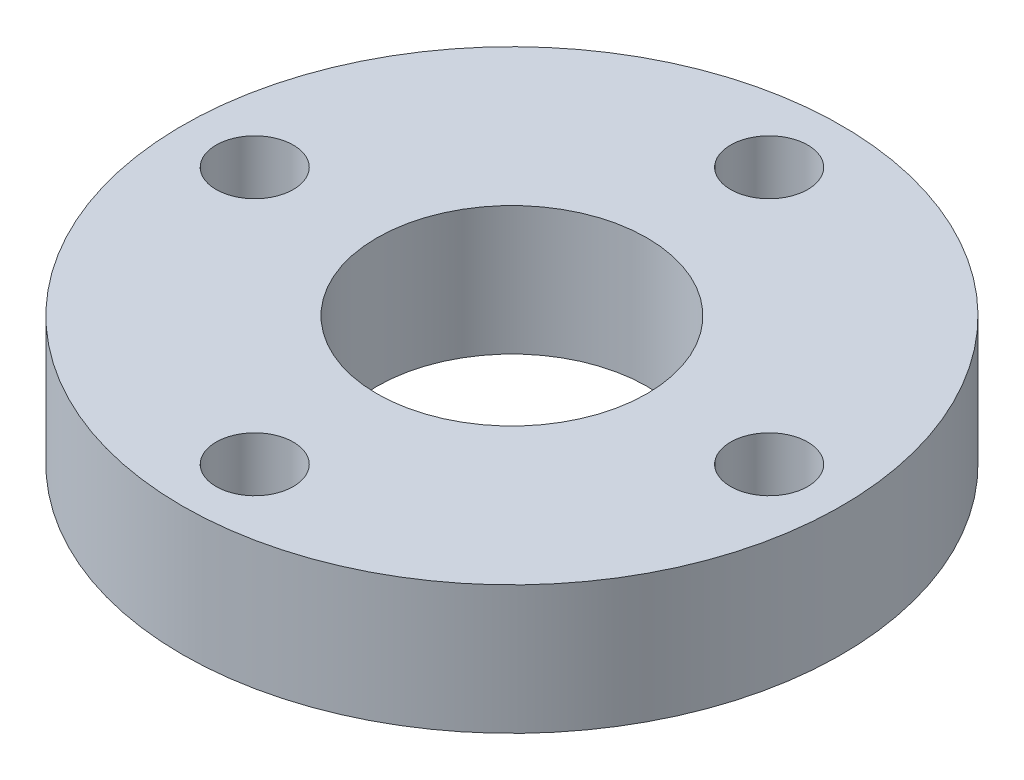
ISO-10303-21;
HEADER;
FILE_DESCRIPTION(('STEP AP214'),'2;1');
FILE_NAME('part.step','',(''),(''),'','','');
FILE_SCHEMA(('AUTOMOTIVE_DESIGN { 1 0 10303 214 1 1 1 1 }'));
ENDSEC;
DATA;
#1=APPLICATION_CONTEXT('core data for automotive mechanical design processes');
#2=APPLICATION_PROTOCOL_DEFINITION('international standard','automotive_design',2000,#1);
#3=PRODUCT_CONTEXT('',#1,'mechanical');
#4=PRODUCT('Part','Part','',(#3));
#5=PRODUCT_RELATED_PRODUCT_CATEGORY('part','',(#4));
#6=PRODUCT_DEFINITION_FORMATION('','',#4);
#7=PRODUCT_DEFINITION_CONTEXT('part definition',#1,'design');
#8=PRODUCT_DEFINITION('design','',#6,#7);
#9=PRODUCT_DEFINITION_SHAPE('','',#8);
#10=(LENGTH_UNIT() NAMED_UNIT(*) SI_UNIT(.MILLI.,.METRE.));
#11=(NAMED_UNIT(*) PLANE_ANGLE_UNIT() SI_UNIT($,.RADIAN.));
#12=(NAMED_UNIT(*) SI_UNIT($,.STERADIAN.) SOLID_ANGLE_UNIT());
#13=UNCERTAINTY_MEASURE_WITH_UNIT(LENGTH_MEASURE(1.E-05),#10,'distance_accuracy_value','');
#14=(GEOMETRIC_REPRESENTATION_CONTEXT(3) GLOBAL_UNCERTAINTY_ASSIGNED_CONTEXT((#13)) GLOBAL_UNIT_ASSIGNED_CONTEXT((#10,
#11,#12)) REPRESENTATION_CONTEXT('',''));
#15=CARTESIAN_POINT('',(0.,0.,0.));
#16=DIRECTION('',(0.,0.,1.));
#17=DIRECTION('',(1.,0.,0.));
#18=AXIS2_PLACEMENT_3D('',#15,#16,#17);
#19=CARTESIAN_POINT('',(0.,4.,0.));
#20=DIRECTION('',(0.,-1.,0.));
#21=DIRECTION('',(0.,0.,-1.));
#22=AXIS2_PLACEMENT_3D('',#19,#20,#21);
#23=CYLINDRICAL_SURFACE('',#22,10.25);
#24=CARTESIAN_POINT('',(0.,4.,0.));
#25=DIRECTION('',(0.,1.,0.));
#26=DIRECTION('',(0.,0.,1.));
#27=AXIS2_PLACEMENT_3D('',#24,#25,#26);
#28=CIRCLE('',#27,10.25);
#29=CARTESIAN_POINT('',(0.,4.,10.25));
#30=VERTEX_POINT('',#29);
#31=EDGE_CURVE('E54',#30,#30,#28,.T.);
#32=ORIENTED_EDGE('',*,*,#31,.F.);
#33=EDGE_LOOP('',(#32));
#34=FACE_BOUND('',#33,.T.);
#35=CARTESIAN_POINT('',(0.,0.,0.));
#36=DIRECTION('',(0.,1.,0.));
#37=DIRECTION('',(0.,0.,1.));
#38=AXIS2_PLACEMENT_3D('',#35,#36,#37);
#39=CIRCLE('',#38,10.25);
#40=CARTESIAN_POINT('',(0.,0.,10.25));
#41=VERTEX_POINT('',#40);
#42=EDGE_CURVE('E79',#41,#41,#39,.T.);
#43=ORIENTED_EDGE('',*,*,#42,.T.);
#44=EDGE_LOOP('',(#43));
#45=FACE_BOUND('',#44,.T.);
#46=ADVANCED_FACE('F45',(#34,#45),#23,.T.);
#47=CARTESIAN_POINT('',(0.,4.,8.));
#48=DIRECTION('',(0.,-1.,0.));
#49=DIRECTION('',(0.,0.,-1.));
#50=AXIS2_PLACEMENT_3D('',#47,#48,#49);
#51=CYLINDRICAL_SURFACE('',#50,1.2);
#52=CARTESIAN_POINT('',(0.,4.,8.));
#53=DIRECTION('',(0.,1.,0.));
#54=DIRECTION('',(0.,0.,1.));
#55=AXIS2_PLACEMENT_3D('',#52,#53,#54);
#56=CIRCLE('',#55,1.2);
#57=CARTESIAN_POINT('',(0.,4.,9.2));
#58=VERTEX_POINT('',#57);
#59=EDGE_CURVE('E60',#58,#58,#56,.T.);
#60=ORIENTED_EDGE('',*,*,#59,.T.);
#61=EDGE_LOOP('',(#60));
#62=FACE_BOUND('',#61,.T.);
#63=CARTESIAN_POINT('',(0.,0.,8.));
#64=DIRECTION('',(0.,1.,0.));
#65=DIRECTION('',(0.,0.,1.));
#66=AXIS2_PLACEMENT_3D('',#63,#64,#65);
#67=CIRCLE('',#66,1.2);
#68=CARTESIAN_POINT('',(0.,0.,9.2));
#69=VERTEX_POINT('',#68);
#70=EDGE_CURVE('E76',#69,#69,#67,.T.);
#71=ORIENTED_EDGE('',*,*,#70,.F.);
#72=EDGE_LOOP('',(#71));
#73=FACE_BOUND('',#72,.T.);
#74=ADVANCED_FACE('F106',(#62,#73),#51,.F.);
#75=CARTESIAN_POINT('',(8.,4.,0.));
#76=DIRECTION('',(0.,-1.,0.));
#77=DIRECTION('',(0.,0.,-1.));
#78=AXIS2_PLACEMENT_3D('',#75,#76,#77);
#79=CYLINDRICAL_SURFACE('',#78,1.2);
#80=CARTESIAN_POINT('',(8.,4.,0.));
#81=DIRECTION('',(0.,1.,0.));
#82=DIRECTION('',(0.,0.,1.));
#83=AXIS2_PLACEMENT_3D('',#80,#81,#82);
#84=CIRCLE('',#83,1.2);
#85=CARTESIAN_POINT('',(8.,4.,1.20000000000003));
#86=VERTEX_POINT('',#85);
#87=EDGE_CURVE('E97',#86,#86,#84,.T.);
#88=ORIENTED_EDGE('',*,*,#87,.T.);
#89=EDGE_LOOP('',(#88));
#90=FACE_BOUND('',#89,.T.);
#91=CARTESIAN_POINT('',(8.,0.,0.));
#92=DIRECTION('',(0.,1.,0.));
#93=DIRECTION('',(0.,0.,1.));
#94=AXIS2_PLACEMENT_3D('',#91,#92,#93);
#95=CIRCLE('',#94,1.2);
#96=CARTESIAN_POINT('',(8.,0.,1.20000000000003));
#97=VERTEX_POINT('',#96);
#98=EDGE_CURVE('E72',#97,#97,#95,.T.);
#99=ORIENTED_EDGE('',*,*,#98,.F.);
#100=EDGE_LOOP('',(#99));
#101=FACE_BOUND('',#100,.T.);
#102=ADVANCED_FACE('F124',(#90,#101),#79,.F.);
#103=CARTESIAN_POINT('',(0.,4.,-8.));
#104=DIRECTION('',(0.,-1.,0.));
#105=DIRECTION('',(0.,0.,-1.));
#106=AXIS2_PLACEMENT_3D('',#103,#104,#105);
#107=CYLINDRICAL_SURFACE('',#106,1.2);
#108=CARTESIAN_POINT('',(0.,4.,-8.));
#109=DIRECTION('',(0.,1.,0.));
#110=DIRECTION('',(0.,0.,1.));
#111=AXIS2_PLACEMENT_3D('',#108,#109,#110);
#112=CIRCLE('',#111,1.2);
#113=CARTESIAN_POINT('',(0.,4.,-6.8));
#114=VERTEX_POINT('',#113);
#115=EDGE_CURVE('E91',#114,#114,#112,.T.);
#116=ORIENTED_EDGE('',*,*,#115,.T.);
#117=EDGE_LOOP('',(#116));
#118=FACE_BOUND('',#117,.T.);
#119=CARTESIAN_POINT('',(0.,0.,-8.));
#120=DIRECTION('',(0.,1.,0.));
#121=DIRECTION('',(0.,0.,1.));
#122=AXIS2_PLACEMENT_3D('',#119,#120,#121);
#123=CIRCLE('',#122,1.2);
#124=CARTESIAN_POINT('',(0.,0.,-6.8));
#125=VERTEX_POINT('',#124);
#126=EDGE_CURVE('E68',#125,#125,#123,.T.);
#127=ORIENTED_EDGE('',*,*,#126,.F.);
#128=EDGE_LOOP('',(#127));
#129=FACE_BOUND('',#128,.T.);
#130=ADVANCED_FACE('F130',(#118,#129),#107,.F.);
#131=CARTESIAN_POINT('',(-8.,4.,0.));
#132=DIRECTION('',(0.,-1.,0.));
#133=DIRECTION('',(0.,0.,-1.));
#134=AXIS2_PLACEMENT_3D('',#131,#132,#133);
#135=CYLINDRICAL_SURFACE('',#134,1.2);
#136=CARTESIAN_POINT('',(-8.,4.,0.));
#137=DIRECTION('',(0.,1.,0.));
#138=DIRECTION('',(0.,0.,1.));
#139=AXIS2_PLACEMENT_3D('',#136,#137,#138);
#140=CIRCLE('',#139,1.2);
#141=CARTESIAN_POINT('',(-8.,4.,1.19999999999992));
#142=VERTEX_POINT('',#141);
#143=EDGE_CURVE('E86',#142,#142,#140,.T.);
#144=ORIENTED_EDGE('',*,*,#143,.T.);
#145=EDGE_LOOP('',(#144));
#146=FACE_BOUND('',#145,.T.);
#147=CARTESIAN_POINT('',(-8.,0.,0.));
#148=DIRECTION('',(0.,1.,0.));
#149=DIRECTION('',(0.,0.,1.));
#150=AXIS2_PLACEMENT_3D('',#147,#148,#149);
#151=CIRCLE('',#150,1.2);
#152=CARTESIAN_POINT('',(-8.,0.,1.19999999999992));
#153=VERTEX_POINT('',#152);
#154=EDGE_CURVE('E64',#153,#153,#151,.T.);
#155=ORIENTED_EDGE('',*,*,#154,.F.);
#156=EDGE_LOOP('',(#155));
#157=FACE_BOUND('',#156,.T.);
#158=ADVANCED_FACE('F47',(#146,#157),#135,.F.);
#159=CARTESIAN_POINT('',(0.,4.,0.));
#160=DIRECTION('',(0.,-1.,0.));
#161=DIRECTION('',(0.,0.,-1.));
#162=AXIS2_PLACEMENT_3D('',#159,#160,#161);
#163=CYLINDRICAL_SURFACE('',#162,4.2);
#164=CARTESIAN_POINT('',(0.,4.,0.));
#165=DIRECTION('',(0.,1.,0.));
#166=DIRECTION('',(0.,0.,1.));
#167=AXIS2_PLACEMENT_3D('',#164,#165,#166);
#168=CIRCLE('',#167,4.2);
#169=CARTESIAN_POINT('',(0.,4.,4.2));
#170=VERTEX_POINT('',#169);
#171=EDGE_CURVE('E10',#170,#170,#168,.T.);
#172=ORIENTED_EDGE('',*,*,#171,.T.);
#173=EDGE_LOOP('',(#172));
#174=FACE_BOUND('',#173,.T.);
#175=CARTESIAN_POINT('',(0.,0.,0.));
#176=DIRECTION('',(0.,1.,0.));
#177=DIRECTION('',(0.,0.,1.));
#178=AXIS2_PLACEMENT_3D('',#175,#176,#177);
#179=CIRCLE('',#178,4.2);
#180=CARTESIAN_POINT('',(0.,0.,4.2));
#181=VERTEX_POINT('',#180);
#182=EDGE_CURVE('E49',#181,#181,#179,.T.);
#183=ORIENTED_EDGE('',*,*,#182,.F.);
#184=EDGE_LOOP('',(#183));
#185=FACE_BOUND('',#184,.T.);
#186=ADVANCED_FACE('F113',(#174,#185),#163,.F.);
#187=CARTESIAN_POINT('',(0.,4.,0.));
#188=DIRECTION('',(0.,1.,0.));
#189=DIRECTION('',(0.,0.,1.));
#190=AXIS2_PLACEMENT_3D('',#187,#188,#189);
#191=PLANE('',#190);
#192=ORIENTED_EDGE('',*,*,#143,.F.);
#193=EDGE_LOOP('',(#192));
#194=FACE_BOUND('',#193,.T.);
#195=ORIENTED_EDGE('',*,*,#115,.F.);
#196=EDGE_LOOP('',(#195));
#197=FACE_BOUND('',#196,.T.);
#198=ORIENTED_EDGE('',*,*,#87,.F.);
#199=EDGE_LOOP('',(#198));
#200=FACE_BOUND('',#199,.T.);
#201=ORIENTED_EDGE('',*,*,#59,.F.);
#202=EDGE_LOOP('',(#201));
#203=FACE_BOUND('',#202,.T.);
#204=ORIENTED_EDGE('',*,*,#31,.T.);
#205=EDGE_LOOP('',(#204));
#206=FACE_BOUND('',#205,.T.);
#207=ORIENTED_EDGE('',*,*,#171,.F.);
#208=EDGE_LOOP('',(#207));
#209=FACE_BOUND('',#208,.T.);
#210=ADVANCED_FACE('F109',(#194,#197,#200,#203,#206,#209),#191,.T.);
#211=CARTESIAN_POINT('',(0.,0.,0.));
#212=DIRECTION('',(0.,1.,0.));
#213=DIRECTION('',(0.,0.,1.));
#214=AXIS2_PLACEMENT_3D('',#211,#212,#213);
#215=PLANE('',#214);
#216=ORIENTED_EDGE('',*,*,#154,.T.);
#217=EDGE_LOOP('',(#216));
#218=FACE_BOUND('',#217,.T.);
#219=ORIENTED_EDGE('',*,*,#126,.T.);
#220=EDGE_LOOP('',(#219));
#221=FACE_BOUND('',#220,.T.);
#222=ORIENTED_EDGE('',*,*,#98,.T.);
#223=EDGE_LOOP('',(#222));
#224=FACE_BOUND('',#223,.T.);
#225=ORIENTED_EDGE('',*,*,#70,.T.);
#226=EDGE_LOOP('',(#225));
#227=FACE_BOUND('',#226,.T.);
#228=ORIENTED_EDGE('',*,*,#42,.F.);
#229=EDGE_LOOP('',(#228));
#230=FACE_BOUND('',#229,.T.);
#231=ORIENTED_EDGE('',*,*,#182,.T.);
#232=EDGE_LOOP('',(#231));
#233=FACE_BOUND('',#232,.T.);
#234=ADVANCED_FACE('F112',(#218,#221,#224,#227,#230,#233),#215,.F.);
#235=CLOSED_SHELL('',(#46,#74,#102,#130,#158,#186,#210,#234));
#236=MANIFOLD_SOLID_BREP('B2',#235);
#237=ADVANCED_BREP_SHAPE_REPRESENTATION('',(#18,#236),#14);
#238=SHAPE_DEFINITION_REPRESENTATION(#9,#237);
ENDSEC;
END-ISO-10303-21;
